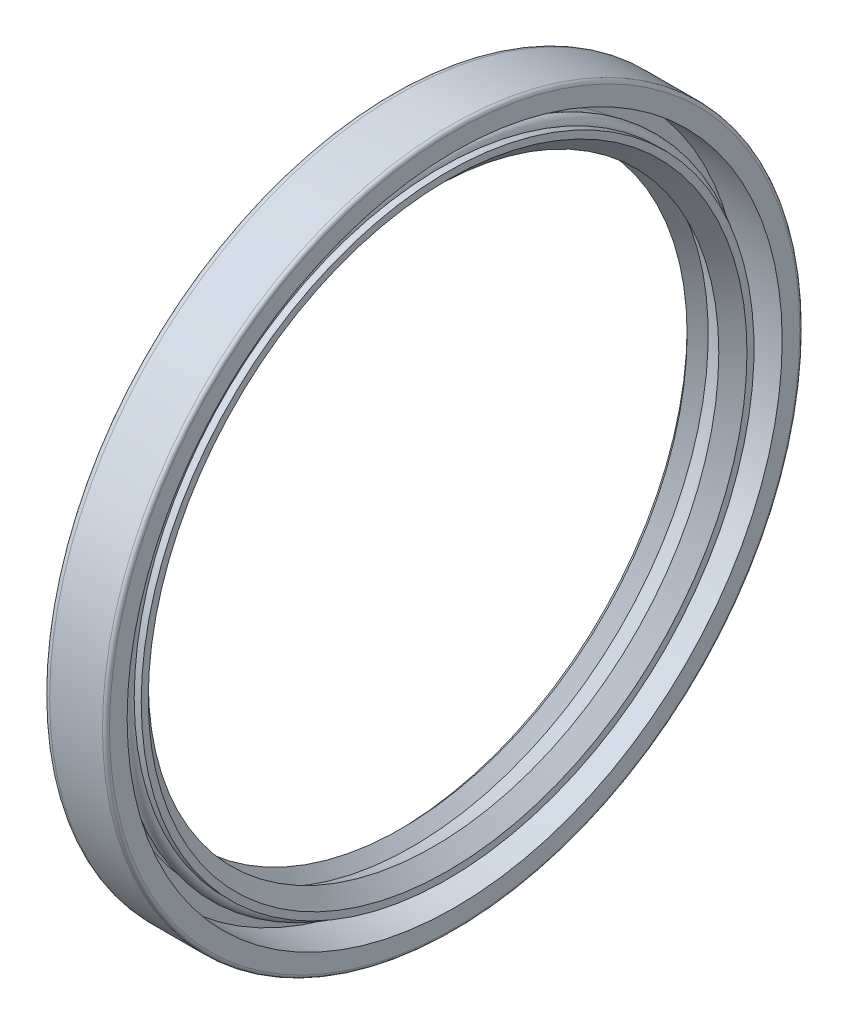
ISO-10303-21;
HEADER;
FILE_DESCRIPTION(('STEP AP214'),'2;1');
FILE_NAME('part.step','',(''),(''),'','','');
FILE_SCHEMA(('AUTOMOTIVE_DESIGN { 1 0 10303 214 1 1 1 1 }'));
ENDSEC;
DATA;
#1=APPLICATION_CONTEXT('core data for automotive mechanical design processes');
#2=APPLICATION_PROTOCOL_DEFINITION('international standard','automotive_design',2000,#1);
#3=PRODUCT_CONTEXT('',#1,'mechanical');
#4=PRODUCT('Part','Part','',(#3));
#5=PRODUCT_RELATED_PRODUCT_CATEGORY('part','',(#4));
#6=PRODUCT_DEFINITION_FORMATION('','',#4);
#7=PRODUCT_DEFINITION_CONTEXT('part definition',#1,'design');
#8=PRODUCT_DEFINITION('design','',#6,#7);
#9=PRODUCT_DEFINITION_SHAPE('','',#8);
#10=(LENGTH_UNIT() NAMED_UNIT(*) SI_UNIT(.MILLI.,.METRE.));
#11=(NAMED_UNIT(*) PLANE_ANGLE_UNIT() SI_UNIT($,.RADIAN.));
#12=(NAMED_UNIT(*) SI_UNIT($,.STERADIAN.) SOLID_ANGLE_UNIT());
#13=UNCERTAINTY_MEASURE_WITH_UNIT(LENGTH_MEASURE(1.E-05),#10,'distance_accuracy_value','');
#14=(GEOMETRIC_REPRESENTATION_CONTEXT(3) GLOBAL_UNCERTAINTY_ASSIGNED_CONTEXT((#13)) GLOBAL_UNIT_ASSIGNED_CONTEXT((#10,
#11,#12)) REPRESENTATION_CONTEXT('',''));
#15=CARTESIAN_POINT('',(0.,0.,0.));
#16=DIRECTION('',(0.,0.,1.));
#17=DIRECTION('',(1.,0.,0.));
#18=AXIS2_PLACEMENT_3D('',#15,#16,#17);
#19=CARTESIAN_POINT('',(0.,-54.4860014821636,-53.888888888889));
#20=DIRECTION('',(-1.,0.,0.));
#21=DIRECTION('',(0.,0.,1.));
#22=AXIS2_PLACEMENT_3D('',#19,#20,#21);
#23=PLANE('',#22);
#24=CARTESIAN_POINT('',(0.,0.,0.));
#25=DIRECTION('',(-1.,0.,0.));
#26=DIRECTION('',(0.,0.,-1.));
#27=AXIS2_PLACEMENT_3D('',#24,#25,#26);
#28=CIRCLE('',#27,53.8888889716726);
#29=CARTESIAN_POINT('',(0.,0.,-53.8888889716726));
#30=VERTEX_POINT('',#29);
#31=EDGE_CURVE('E108',#30,#30,#28,.F.);
#32=ORIENTED_EDGE('',*,*,#31,.F.);
#33=EDGE_LOOP('',(#32));
#34=FACE_BOUND('',#33,.T.);
#35=CARTESIAN_POINT('',(0.,0.,0.));
#36=DIRECTION('',(1.,0.,0.));
#37=DIRECTION('',(0.,-1.16852805281415E-09,1.));
#38=AXIS2_PLACEMENT_3D('',#35,#36,#37);
#39=CIRCLE('',#38,51.666666666667);
#40=CARTESIAN_POINT('',(0.,-6.03739493953981E-08,51.666666666667));
#41=VERTEX_POINT('',#40);
#42=EDGE_CURVE('E104',#41,#41,#39,.T.);
#43=ORIENTED_EDGE('',*,*,#42,.T.);
#44=EDGE_LOOP('',(#43));
#45=FACE_BOUND('',#44,.T.);
#46=ADVANCED_FACE('F15',(#34,#45),#23,.T.);
#47=CARTESIAN_POINT('',(0.2,-52.2391559654918,-51.666666666667));
#48=DIRECTION('',(-1.,0.,0.));
#49=DIRECTION('',(0.,0.,1.));
#50=AXIS2_PLACEMENT_3D('',#47,#48,#49);
#51=PLANE('',#50);
#52=CARTESIAN_POINT('',(0.2,0.,0.));
#53=DIRECTION('',(-1.,0.,0.));
#54=DIRECTION('',(0.,0.,-1.));
#55=AXIS2_PLACEMENT_3D('',#52,#53,#54);
#56=CIRCLE('',#55,51.666666666667);
#57=CARTESIAN_POINT('',(0.2,0.,-51.666666666667));
#58=VERTEX_POINT('',#57);
#59=EDGE_CURVE('E100',#58,#58,#56,.F.);
#60=ORIENTED_EDGE('',*,*,#59,.F.);
#61=EDGE_LOOP('',(#60));
#62=FACE_BOUND('',#61,.T.);
#63=CARTESIAN_POINT('',(0.2,0.,0.));
#64=DIRECTION('',(1.,0.,0.));
#65=DIRECTION('',(0.,0.,1.));
#66=AXIS2_PLACEMENT_3D('',#63,#64,#65);
#67=CIRCLE('',#66,48.333333333333);
#68=CARTESIAN_POINT('',(0.2,0.,48.333333333333));
#69=VERTEX_POINT('',#68);
#70=EDGE_CURVE('E96',#69,#69,#67,.T.);
#71=ORIENTED_EDGE('',*,*,#70,.T.);
#72=EDGE_LOOP('',(#71));
#73=FACE_BOUND('',#72,.T.);
#74=ADVANCED_FACE('F117',(#62,#73),#51,.T.);
#75=CARTESIAN_POINT('',(0.,-48.8688879273009,-48.333333333333));
#76=DIRECTION('',(-1.,0.,0.));
#77=DIRECTION('',(0.,0.,1.));
#78=AXIS2_PLACEMENT_3D('',#75,#76,#77);
#79=PLANE('',#78);
#80=CARTESIAN_POINT('',(0.,0.,0.));
#81=DIRECTION('',(-1.,0.,0.));
#82=DIRECTION('',(0.,0.,-1.));
#83=AXIS2_PLACEMENT_3D('',#80,#81,#82);
#84=CIRCLE('',#83,48.333333333333);
#85=CARTESIAN_POINT('',(0.,0.,-48.333333333333));
#86=VERTEX_POINT('',#85);
#87=EDGE_CURVE('E92',#86,#86,#84,.F.);
#88=ORIENTED_EDGE('',*,*,#87,.F.);
#89=EDGE_LOOP('',(#88));
#90=FACE_BOUND('',#89,.T.);
#91=CARTESIAN_POINT('',(0.,0.,0.));
#92=DIRECTION('',(1.,0.,0.));
#93=DIRECTION('',(0.,-1.16843741699612E-09,1.));
#94=AXIS2_PLACEMENT_3D('',#91,#92,#93);
#95=CIRCLE('',#94,47.5);
#96=CARTESIAN_POINT('',(0.,-5.55007773073157E-08,47.5));
#97=VERTEX_POINT('',#96);
#98=EDGE_CURVE('E88',#97,#97,#95,.T.);
#99=ORIENTED_EDGE('',*,*,#98,.T.);
#100=EDGE_LOOP('',(#99));
#101=FACE_BOUND('',#100,.T.);
#102=ADVANCED_FACE('F308',(#90,#101),#79,.T.);
#103=CARTESIAN_POINT('',(8.8888888333333,-48.8688879273009,48.333333333333));
#104=DIRECTION('',(1.,0.,0.));
#105=DIRECTION('',(0.,0.,-1.));
#106=AXIS2_PLACEMENT_3D('',#103,#104,#105);
#107=PLANE('',#106);
#108=CARTESIAN_POINT('',(8.8888888333333,0.,0.));
#109=DIRECTION('',(1.,0.,0.));
#110=DIRECTION('',(0.,0.,1.));
#111=AXIS2_PLACEMENT_3D('',#108,#109,#110);
#112=CIRCLE('',#111,48.333333333333);
#113=CARTESIAN_POINT('',(8.8888888333333,0.,48.333333333333));
#114=VERTEX_POINT('',#113);
#115=EDGE_CURVE('E84',#114,#114,#112,.T.);
#116=ORIENTED_EDGE('',*,*,#115,.T.);
#117=EDGE_LOOP('',(#116));
#118=FACE_BOUND('',#117,.T.);
#119=CARTESIAN_POINT('',(8.8888888333333,0.,0.));
#120=DIRECTION('',(-1.,0.,0.));
#121=DIRECTION('',(0.,0.,-1.));
#122=AXIS2_PLACEMENT_3D('',#119,#120,#121);
#123=CIRCLE('',#122,47.222222166667);
#124=CARTESIAN_POINT('',(8.8888888333333,0.,-47.222222166667));
#125=VERTEX_POINT('',#124);
#126=EDGE_CURVE('E80',#125,#125,#123,.F.);
#127=ORIENTED_EDGE('',*,*,#126,.F.);
#128=EDGE_LOOP('',(#127));
#129=FACE_BOUND('',#128,.T.);
#130=ADVANCED_FACE('F299',(#118,#129),#107,.T.);
#131=CARTESIAN_POINT('',(3.3333333333333,-52.2391559770617,51.666666666667));
#132=DIRECTION('',(1.,0.,0.));
#133=DIRECTION('',(0.,0.,-1.));
#134=AXIS2_PLACEMENT_3D('',#131,#132,#133);
#135=PLANE('',#134);
#136=CARTESIAN_POINT('',(3.3333333333333,0.,0.));
#137=DIRECTION('',(1.,0.,0.));
#138=DIRECTION('',(0.,-1.16852819033855E-09,1.));
#139=AXIS2_PLACEMENT_3D('',#136,#137,#138);
#140=CIRCLE('',#139,51.666666666667);
#141=CARTESIAN_POINT('',(3.3333333333333,-6.03739565008254E-08,51.666666666667));
#142=VERTEX_POINT('',#141);
#143=EDGE_CURVE('E76',#142,#142,#140,.T.);
#144=ORIENTED_EDGE('',*,*,#143,.T.);
#145=EDGE_LOOP('',(#144));
#146=FACE_BOUND('',#145,.T.);
#147=CARTESIAN_POINT('',(3.3333333333333,0.,0.));
#148=DIRECTION('',(-1.,0.,0.));
#149=DIRECTION('',(0.,0.,-1.));
#150=AXIS2_PLACEMENT_3D('',#147,#148,#149);
#151=CIRCLE('',#150,48.8888888979905);
#152=CARTESIAN_POINT('',(3.3333333333333,0.,-48.8888888979905));
#153=VERTEX_POINT('',#152);
#154=EDGE_CURVE('E72',#153,#153,#151,.F.);
#155=ORIENTED_EDGE('',*,*,#154,.F.);
#156=EDGE_LOOP('',(#155));
#157=FACE_BOUND('',#156,.T.);
#158=ADVANCED_FACE('F135',(#146,#157),#135,.T.);
#159=CARTESIAN_POINT('',(10.,-55.0477128376493,54.444444444444));
#160=DIRECTION('',(1.,0.,0.));
#161=DIRECTION('',(0.,0.,-1.));
#162=AXIS2_PLACEMENT_3D('',#159,#160,#161);
#163=PLANE('',#162);
#164=CARTESIAN_POINT('',(10.,0.,0.));
#165=DIRECTION('',(1.,0.,0.));
#166=DIRECTION('',(0.,0.,1.));
#167=AXIS2_PLACEMENT_3D('',#164,#165,#166);
#168=CIRCLE('',#167,54.444444444444);
#169=CARTESIAN_POINT('',(10.,0.,54.444444444444));
#170=VERTEX_POINT('',#169);
#171=EDGE_CURVE('E68',#170,#170,#168,.T.);
#172=ORIENTED_EDGE('',*,*,#171,.T.);
#173=EDGE_LOOP('',(#172));
#174=FACE_BOUND('',#173,.T.);
#175=CARTESIAN_POINT('',(10.,0.,0.));
#176=DIRECTION('',(-1.,0.,0.));
#177=DIRECTION('',(0.,0.,-1.));
#178=AXIS2_PLACEMENT_3D('',#175,#176,#177);
#179=CIRCLE('',#178,51.666666666667);
#180=CARTESIAN_POINT('',(10.,0.,-51.666666666667));
#181=VERTEX_POINT('',#180);
#182=EDGE_CURVE('E64',#181,#181,#179,.F.);
#183=ORIENTED_EDGE('',*,*,#182,.F.);
#184=EDGE_LOOP('',(#183));
#185=FACE_BOUND('',#184,.T.);
#186=ADVANCED_FACE('F124',(#174,#185),#163,.T.);
#187=CARTESIAN_POINT('',(10.,0.,0.));
#188=DIRECTION('',(1.,0.,0.));
#189=DIRECTION('',(0.,-1.16852826270011E-09,1.));
#190=AXIS2_PLACEMENT_3D('',#187,#188,#189);
#191=CYLINDRICAL_SURFACE('',#190,51.666666666667);
#192=ORIENTED_EDGE('',*,*,#59,.T.);
#193=EDGE_LOOP('',(#192));
#194=FACE_BOUND('',#193,.T.);
#195=ORIENTED_EDGE('',*,*,#42,.F.);
#196=EDGE_LOOP('',(#195));
#197=FACE_BOUND('',#196,.T.);
#198=ADVANCED_FACE('F121',(#194,#197),#191,.F.);
#199=CARTESIAN_POINT('',(10.,0.,0.));
#200=DIRECTION('',(1.,0.,0.));
#201=DIRECTION('',(0.,0.,1.));
#202=AXIS2_PLACEMENT_3D('',#199,#200,#201);
#203=CYLINDRICAL_SURFACE('',#202,48.333333333333);
#204=ORIENTED_EDGE('',*,*,#87,.T.);
#205=EDGE_LOOP('',(#204));
#206=FACE_BOUND('',#205,.T.);
#207=ORIENTED_EDGE('',*,*,#70,.F.);
#208=EDGE_LOOP('',(#207));
#209=FACE_BOUND('',#208,.T.);
#210=ADVANCED_FACE('F123',(#206,#209),#203,.T.);
#211=CARTESIAN_POINT('',(0.,0.,0.));
#212=DIRECTION('',(-1.,0.,0.));
#213=DIRECTION('',(0.,0.,-1.));
#214=AXIS2_PLACEMENT_3D('',#211,#212,#213);
#215=CONICAL_SURFACE('',#214,47.5,0.46364760900063);
#216=ORIENTED_EDGE('',*,*,#98,.F.);
#217=EDGE_LOOP('',(#216));
#218=FACE_BOUND('',#217,.T.);
#219=CARTESIAN_POINT('',(1.66666666666667,0.,0.));
#220=DIRECTION('',(1.,0.,0.));
#221=DIRECTION('',(0.,0.,1.));
#222=AXIS2_PLACEMENT_3D('',#219,#220,#221);
#223=CIRCLE('',#222,46.666666666667);
#224=CARTESIAN_POINT('',(1.66666666666667,0.,46.666666666667));
#225=VERTEX_POINT('',#224);
#226=EDGE_CURVE('E60',#225,#225,#223,.T.);
#227=ORIENTED_EDGE('',*,*,#226,.T.);
#228=EDGE_LOOP('',(#227));
#229=FACE_BOUND('',#228,.T.);
#230=ADVANCED_FACE('F132',(#218,#229),#215,.F.);
#231=CARTESIAN_POINT('',(1.66666666666671,0.,0.));
#232=DIRECTION('',(1.,0.,0.));
#233=DIRECTION('',(0.,0.,1.));
#234=AXIS2_PLACEMENT_3D('',#231,#232,#233);
#235=CONICAL_SURFACE('',#234,46.666666666667,0.785398163397832);
#236=CARTESIAN_POINT('',(0.833333333333336,0.,0.));
#237=DIRECTION('',(1.,0.,0.));
#238=DIRECTION('',(0.,0.,1.));
#239=AXIS2_PLACEMENT_3D('',#236,#237,#238);
#240=CIRCLE('',#239,45.833333333333);
#241=CARTESIAN_POINT('',(0.833333333333336,0.,45.833333333333));
#242=VERTEX_POINT('',#241);
#243=EDGE_CURVE('E56',#242,#242,#240,.T.);
#244=ORIENTED_EDGE('',*,*,#243,.T.);
#245=EDGE_LOOP('',(#244));
#246=FACE_BOUND('',#245,.T.);
#247=ORIENTED_EDGE('',*,*,#226,.F.);
#248=EDGE_LOOP('',(#247));
#249=FACE_BOUND('',#248,.T.);
#250=ADVANCED_FACE('F142',(#246,#249),#235,.T.);
#251=CARTESIAN_POINT('',(0.833333333333329,0.,0.));
#252=DIRECTION('',(-1.,0.,0.));
#253=DIRECTION('',(0.,0.,-1.));
#254=AXIS2_PLACEMENT_3D('',#251,#252,#253);
#255=CONICAL_SURFACE('',#254,45.833333333333,0.785398163397237);
#256=ORIENTED_EDGE('',*,*,#243,.F.);
#257=EDGE_LOOP('',(#256));
#258=FACE_BOUND('',#257,.T.);
#259=CARTESIAN_POINT('',(1.6666666666667,0.,0.));
#260=DIRECTION('',(1.,0.,0.));
#261=DIRECTION('',(0.,0.,1.));
#262=AXIS2_PLACEMENT_3D('',#259,#260,#261);
#263=CIRCLE('',#262,45.);
#264=CARTESIAN_POINT('',(1.6666666666667,0.,45.));
#265=VERTEX_POINT('',#264);
#266=EDGE_CURVE('E52',#265,#265,#263,.T.);
#267=ORIENTED_EDGE('',*,*,#266,.T.);
#268=EDGE_LOOP('',(#267));
#269=FACE_BOUND('',#268,.T.);
#270=ADVANCED_FACE('F146',(#258,#269),#255,.F.);
#271=CARTESIAN_POINT('',(3.3333333333333,0.,0.));
#272=DIRECTION('',(1.,0.,0.));
#273=DIRECTION('',(0.,0.,1.));
#274=AXIS2_PLACEMENT_3D('',#271,#272,#273);
#275=CONICAL_SURFACE('',#274,46.666666666667,0.78539816339757);
#276=CARTESIAN_POINT('',(3.3333333333333,0.,0.));
#277=DIRECTION('',(1.,0.,0.));
#278=DIRECTION('',(0.,0.,1.));
#279=AXIS2_PLACEMENT_3D('',#276,#277,#278);
#280=CIRCLE('',#279,46.666666666667);
#281=CARTESIAN_POINT('',(3.3333333333333,0.,46.666666666667));
#282=VERTEX_POINT('',#281);
#283=EDGE_CURVE('E48',#282,#282,#280,.T.);
#284=ORIENTED_EDGE('',*,*,#283,.T.);
#285=EDGE_LOOP('',(#284));
#286=FACE_BOUND('',#285,.T.);
#287=ORIENTED_EDGE('',*,*,#266,.F.);
#288=EDGE_LOOP('',(#287));
#289=FACE_BOUND('',#288,.T.);
#290=ADVANCED_FACE('F150',(#286,#289),#275,.F.);
#291=CARTESIAN_POINT('',(3.3333333333333,0.,0.));
#292=DIRECTION('',(-1.,0.,0.));
#293=DIRECTION('',(0.,0.,-1.));
#294=AXIS2_PLACEMENT_3D('',#291,#292,#293);
#295=CONICAL_SURFACE('',#294,46.666666666667,0.463647609000879);
#296=ORIENTED_EDGE('',*,*,#283,.F.);
#297=EDGE_LOOP('',(#296));
#298=FACE_BOUND('',#297,.T.);
#299=CARTESIAN_POINT('',(6.66666666666671,0.,0.));
#300=DIRECTION('',(1.,0.,0.));
#301=DIRECTION('',(0.,0.,1.));
#302=AXIS2_PLACEMENT_3D('',#299,#300,#301);
#303=CIRCLE('',#302,45.);
#304=CARTESIAN_POINT('',(6.66666666666671,0.,45.));
#305=VERTEX_POINT('',#304);
#306=EDGE_CURVE('E44',#305,#305,#303,.T.);
#307=ORIENTED_EDGE('',*,*,#306,.T.);
#308=EDGE_LOOP('',(#307));
#309=FACE_BOUND('',#308,.T.);
#310=ADVANCED_FACE('F154',(#298,#309),#295,.F.);
#311=CARTESIAN_POINT('',(8.8888888333333,0.,0.));
#312=DIRECTION('',(1.,0.,0.));
#313=DIRECTION('',(0.,0.,1.));
#314=AXIS2_PLACEMENT_3D('',#311,#312,#313);
#315=CONICAL_SURFACE('',#314,47.222222166667,0.785398163397539);
#316=ORIENTED_EDGE('',*,*,#126,.T.);
#317=EDGE_LOOP('',(#316));
#318=FACE_BOUND('',#317,.T.);
#319=ORIENTED_EDGE('',*,*,#306,.F.);
#320=EDGE_LOOP('',(#319));
#321=FACE_BOUND('',#320,.T.);
#322=ADVANCED_FACE('F158',(#318,#321),#315,.F.);
#323=CARTESIAN_POINT('',(10.,0.,0.));
#324=DIRECTION('',(1.,0.,0.));
#325=DIRECTION('',(0.,0.,1.));
#326=AXIS2_PLACEMENT_3D('',#323,#324,#325);
#327=CYLINDRICAL_SURFACE('',#326,48.333333333333);
#328=CARTESIAN_POINT('',(7.7777776666667,0.,0.));
#329=DIRECTION('',(1.,0.,0.));
#330=DIRECTION('',(0.,0.,1.));
#331=AXIS2_PLACEMENT_3D('',#328,#329,#330);
#332=CIRCLE('',#331,48.333333333333);
#333=CARTESIAN_POINT('',(7.7777776666667,0.,48.333333333333));
#334=VERTEX_POINT('',#333);
#335=EDGE_CURVE('E40',#334,#334,#332,.T.);
#336=ORIENTED_EDGE('',*,*,#335,.T.);
#337=EDGE_LOOP('',(#336));
#338=FACE_BOUND('',#337,.T.);
#339=ORIENTED_EDGE('',*,*,#115,.F.);
#340=EDGE_LOOP('',(#339));
#341=FACE_BOUND('',#340,.T.);
#342=ADVANCED_FACE('F162',(#338,#341),#327,.T.);
#343=CARTESIAN_POINT('',(6.6666666666667,0.,0.));
#344=DIRECTION('',(1.,0.,0.));
#345=DIRECTION('',(0.,0.,1.));
#346=AXIS2_PLACEMENT_3D('',#343,#344,#345);
#347=TOROIDAL_SURFACE('',#346,48.333333333333,1.111111);
#348=CARTESIAN_POINT('',(5.5555556666667,0.,0.));
#349=DIRECTION('',(1.,0.,0.));
#350=DIRECTION('',(0.,0.,1.));
#351=AXIS2_PLACEMENT_3D('',#348,#349,#350);
#352=CIRCLE('',#351,48.333333333333);
#353=CARTESIAN_POINT('',(5.5555556666667,0.,48.333333333333));
#354=VERTEX_POINT('',#353);
#355=EDGE_CURVE('E34',#354,#354,#352,.T.);
#356=ORIENTED_EDGE('',*,*,#355,.T.);
#357=EDGE_LOOP('',(#356));
#358=FACE_BOUND('',#357,.T.);
#359=ORIENTED_EDGE('',*,*,#335,.F.);
#360=EDGE_LOOP('',(#359));
#361=FACE_BOUND('',#360,.T.);
#362=ADVANCED_FACE('F166',(#358,#361),#347,.T.);
#363=CARTESIAN_POINT('',(10.,0.,0.));
#364=DIRECTION('',(1.,0.,0.));
#365=DIRECTION('',(0.,0.,1.));
#366=AXIS2_PLACEMENT_3D('',#363,#364,#365);
#367=CYLINDRICAL_SURFACE('',#366,48.333333333333);
#368=CARTESIAN_POINT('',(3.8888888333333,0.,0.));
#369=DIRECTION('',(1.,0.,0.));
#370=DIRECTION('',(0.,0.,1.));
#371=AXIS2_PLACEMENT_3D('',#368,#369,#370);
#372=CIRCLE('',#371,48.333333333333);
#373=CARTESIAN_POINT('',(3.8888888333333,0.,48.333333333333));
#374=VERTEX_POINT('',#373);
#375=EDGE_CURVE('E29',#374,#374,#372,.T.);
#376=ORIENTED_EDGE('',*,*,#375,.T.);
#377=EDGE_LOOP('',(#376));
#378=FACE_BOUND('',#377,.T.);
#379=ORIENTED_EDGE('',*,*,#355,.F.);
#380=EDGE_LOOP('',(#379));
#381=FACE_BOUND('',#380,.T.);
#382=ADVANCED_FACE('F170',(#378,#381),#367,.T.);
#383=CARTESIAN_POINT('',(3.88888883333426,0.,0.));
#384=DIRECTION('',(1.,0.,0.));
#385=DIRECTION('',(0.,0.,1.));
#386=AXIS2_PLACEMENT_3D('',#383,#384,#385);
#387=TOROIDAL_SURFACE('',#386,48.888888833334,0.555555500000964);
#388=ORIENTED_EDGE('',*,*,#154,.T.);
#389=EDGE_LOOP('',(#388));
#390=FACE_BOUND('',#389,.T.);
#391=ORIENTED_EDGE('',*,*,#375,.F.);
#392=EDGE_LOOP('',(#391));
#393=FACE_BOUND('',#392,.T.);
#394=ADVANCED_FACE('F174',(#390,#393),#387,.F.);
#395=CARTESIAN_POINT('',(10.,0.,0.));
#396=DIRECTION('',(1.,0.,0.));
#397=DIRECTION('',(0.,0.,1.));
#398=AXIS2_PLACEMENT_3D('',#395,#396,#397);
#399=CYLINDRICAL_SURFACE('',#398,51.666666666667);
#400=ORIENTED_EDGE('',*,*,#182,.T.);
#401=EDGE_LOOP('',(#400));
#402=FACE_BOUND('',#401,.T.);
#403=ORIENTED_EDGE('',*,*,#143,.F.);
#404=EDGE_LOOP('',(#403));
#405=FACE_BOUND('',#404,.T.);
#406=ADVANCED_FACE('F178',(#402,#405),#399,.F.);
#407=CARTESIAN_POINT('',(9.44444444444499,0.,0.));
#408=DIRECTION('',(1.,0.,0.));
#409=DIRECTION('',(0.,0.,1.));
#410=AXIS2_PLACEMENT_3D('',#407,#408,#409);
#411=TOROIDAL_SURFACE('',#410,54.444444444445,0.555555555555006);
#412=CARTESIAN_POINT('',(9.44444444444499,0.,0.));
#413=DIRECTION('',(1.,0.,0.));
#414=DIRECTION('',(0.,0.,1.));
#415=AXIS2_PLACEMENT_3D('',#412,#413,#414);
#416=CIRCLE('',#415,55.);
#417=CARTESIAN_POINT('',(9.44444444444499,0.,55.));
#418=VERTEX_POINT('',#417);
#419=EDGE_CURVE('E23',#418,#418,#416,.T.);
#420=ORIENTED_EDGE('',*,*,#419,.T.);
#421=EDGE_LOOP('',(#420));
#422=FACE_BOUND('',#421,.T.);
#423=ORIENTED_EDGE('',*,*,#171,.F.);
#424=EDGE_LOOP('',(#423));
#425=FACE_BOUND('',#424,.T.);
#426=ADVANCED_FACE('F182',(#422,#425),#411,.T.);
#427=CARTESIAN_POINT('',(10.,0.,0.));
#428=DIRECTION('',(1.,0.,0.));
#429=DIRECTION('',(0.,0.,1.));
#430=AXIS2_PLACEMENT_3D('',#427,#428,#429);
#431=CYLINDRICAL_SURFACE('',#430,55.);
#432=CARTESIAN_POINT('',(1.1111111111111,0.,0.));
#433=DIRECTION('',(1.,0.,0.));
#434=DIRECTION('',(0.,0.,1.));
#435=AXIS2_PLACEMENT_3D('',#432,#433,#434);
#436=CIRCLE('',#435,55.);
#437=CARTESIAN_POINT('',(1.1111111111111,0.,55.));
#438=VERTEX_POINT('',#437);
#439=EDGE_CURVE('E10',#438,#438,#436,.T.);
#440=ORIENTED_EDGE('',*,*,#439,.T.);
#441=EDGE_LOOP('',(#440));
#442=FACE_BOUND('',#441,.T.);
#443=ORIENTED_EDGE('',*,*,#419,.F.);
#444=EDGE_LOOP('',(#443));
#445=FACE_BOUND('',#444,.T.);
#446=ADVANCED_FACE('F185',(#442,#445),#431,.T.);
#447=CARTESIAN_POINT('',(1.11111111111158,0.,0.));
#448=DIRECTION('',(1.,0.,0.));
#449=DIRECTION('',(0.,0.,1.));
#450=AXIS2_PLACEMENT_3D('',#447,#448,#449);
#451=TOROIDAL_SURFACE('',#450,53.8888888888884,1.11111111111159);
#452=ORIENTED_EDGE('',*,*,#31,.T.);
#453=EDGE_LOOP('',(#452));
#454=FACE_BOUND('',#453,.T.);
#455=ORIENTED_EDGE('',*,*,#439,.F.);
#456=EDGE_LOOP('',(#455));
#457=FACE_BOUND('',#456,.T.);
#458=ADVANCED_FACE('F17',(#454,#457),#451,.T.);
#459=CLOSED_SHELL('',(#46,#74,#102,#130,#158,#186,#198,#210,#230,#250,#270,#290,#310,#322,#342,
#362,#382,#394,#406,#426,#446,#458));
#460=MANIFOLD_SOLID_BREP('B1',#459);
#461=ADVANCED_BREP_SHAPE_REPRESENTATION('',(#18,#460),#14);
#462=SHAPE_DEFINITION_REPRESENTATION(#9,#461);
ENDSEC;
END-ISO-10303-21;
